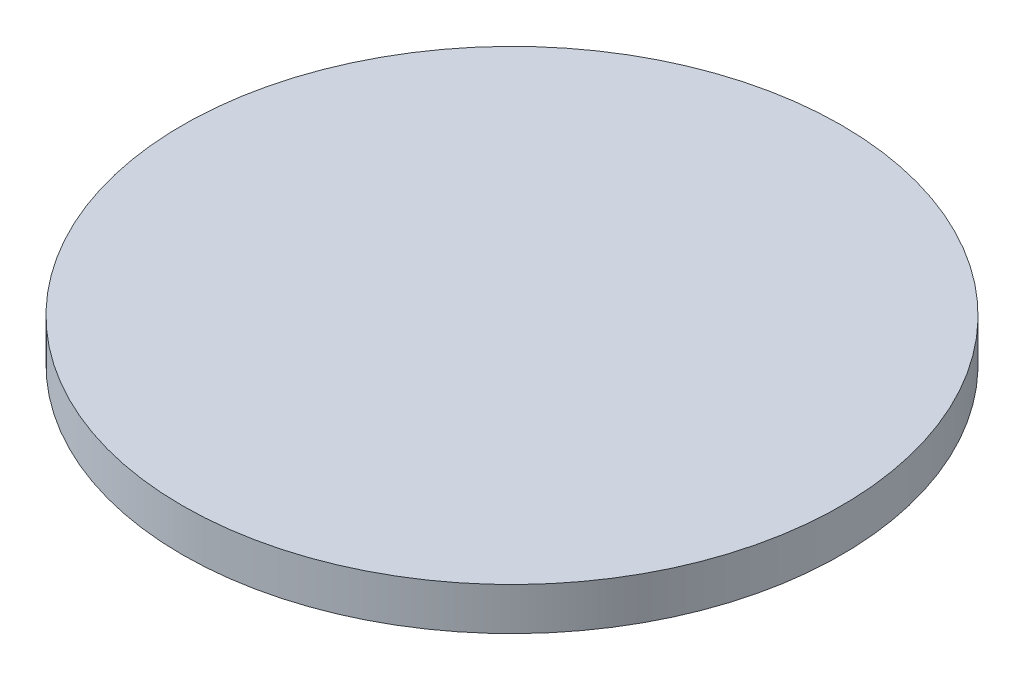
ISO-10303-21;
HEADER;
FILE_DESCRIPTION(('STEP AP214'),'2;1');
FILE_NAME('part.step','',(''),(''),'','','');
FILE_SCHEMA(('AUTOMOTIVE_DESIGN { 1 0 10303 214 1 1 1 1 }'));
ENDSEC;
DATA;
#1=APPLICATION_CONTEXT('core data for automotive mechanical design processes');
#2=APPLICATION_PROTOCOL_DEFINITION('international standard','automotive_design',2000,#1);
#3=PRODUCT_CONTEXT('',#1,'mechanical');
#4=PRODUCT('Part','Part','',(#3));
#5=PRODUCT_RELATED_PRODUCT_CATEGORY('part','',(#4));
#6=PRODUCT_DEFINITION_FORMATION('','',#4);
#7=PRODUCT_DEFINITION_CONTEXT('part definition',#1,'design');
#8=PRODUCT_DEFINITION('design','',#6,#7);
#9=PRODUCT_DEFINITION_SHAPE('','',#8);
#10=(LENGTH_UNIT() NAMED_UNIT(*) SI_UNIT(.MILLI.,.METRE.));
#11=(NAMED_UNIT(*) PLANE_ANGLE_UNIT() SI_UNIT($,.RADIAN.));
#12=(NAMED_UNIT(*) SI_UNIT($,.STERADIAN.) SOLID_ANGLE_UNIT());
#13=UNCERTAINTY_MEASURE_WITH_UNIT(LENGTH_MEASURE(1.E-05),#10,'distance_accuracy_value','');
#14=(GEOMETRIC_REPRESENTATION_CONTEXT(3) GLOBAL_UNCERTAINTY_ASSIGNED_CONTEXT((#13)) GLOBAL_UNIT_ASSIGNED_CONTEXT((#10,
#11,#12)) REPRESENTATION_CONTEXT('',''));
#15=CARTESIAN_POINT('',(0.,0.,0.));
#16=DIRECTION('',(0.,0.,1.));
#17=DIRECTION('',(1.,0.,0.));
#18=AXIS2_PLACEMENT_3D('',#15,#16,#17);
#19=CARTESIAN_POINT('',(-90.676229807166,6.35,-17.2924220305333));
#20=DIRECTION('',(0.,-1.,0.));
#21=DIRECTION('',(0.,0.,-1.));
#22=AXIS2_PLACEMENT_3D('',#19,#20,#21);
#23=CYLINDRICAL_SURFACE('',#22,49.2125);
#24=CARTESIAN_POINT('',(-90.676229807166,6.35,-17.2924220305333));
#25=DIRECTION('',(0.,1.,0.));
#26=DIRECTION('',(0.,0.,1.));
#27=AXIS2_PLACEMENT_3D('',#24,#25,#26);
#28=CIRCLE('',#27,49.2125);
#29=CARTESIAN_POINT('',(-90.676229807166,6.35,31.9200779694668));
#30=VERTEX_POINT('',#29);
#31=EDGE_CURVE('E10',#30,#30,#28,.T.);
#32=ORIENTED_EDGE('',*,*,#31,.F.);
#33=EDGE_LOOP('',(#32));
#34=FACE_BOUND('',#33,.T.);
#35=CARTESIAN_POINT('',(-90.676229807166,0.,-17.2924220305333));
#36=DIRECTION('',(0.,1.,0.));
#37=DIRECTION('',(0.,0.,1.));
#38=AXIS2_PLACEMENT_3D('',#35,#36,#37);
#39=CIRCLE('',#38,49.2125);
#40=CARTESIAN_POINT('',(-90.676229807166,0.,31.9200779694668));
#41=VERTEX_POINT('',#40);
#42=EDGE_CURVE('E34',#41,#41,#39,.T.);
#43=ORIENTED_EDGE('',*,*,#42,.T.);
#44=EDGE_LOOP('',(#43));
#45=FACE_BOUND('',#44,.T.);
#46=ADVANCED_FACE('F31',(#34,#45),#23,.T.);
#47=CARTESIAN_POINT('',(-90.676229807166,6.35,-17.2924220305333));
#48=DIRECTION('',(0.,1.,0.));
#49=DIRECTION('',(0.,0.,1.));
#50=AXIS2_PLACEMENT_3D('',#47,#48,#49);
#51=PLANE('',#50);
#52=ORIENTED_EDGE('',*,*,#31,.T.);
#53=EDGE_LOOP('',(#52));
#54=FACE_BOUND('',#53,.T.);
#55=ADVANCED_FACE('F46',(#54),#51,.T.);
#56=CARTESIAN_POINT('',(-90.676229807166,0.,-17.2924220305333));
#57=DIRECTION('',(0.,1.,0.));
#58=DIRECTION('',(0.,0.,1.));
#59=AXIS2_PLACEMENT_3D('',#56,#57,#58);
#60=PLANE('',#59);
#61=ORIENTED_EDGE('',*,*,#42,.F.);
#62=EDGE_LOOP('',(#61));
#63=FACE_BOUND('',#62,.T.);
#64=ADVANCED_FACE('F44',(#63),#60,.F.);
#65=CLOSED_SHELL('',(#46,#55,#64));
#66=MANIFOLD_SOLID_BREP('B2',#65);
#67=ADVANCED_BREP_SHAPE_REPRESENTATION('',(#18,#66),#14);
#68=SHAPE_DEFINITION_REPRESENTATION(#9,#67);
ENDSEC;
END-ISO-10303-21;
